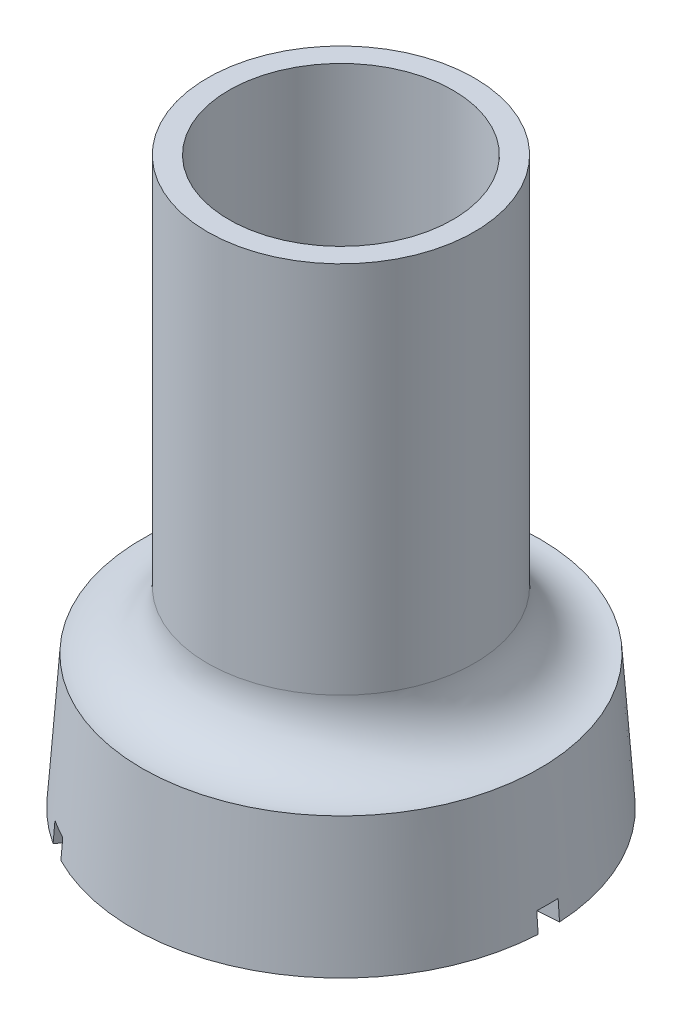
ISO-10303-21;
HEADER;
FILE_DESCRIPTION(('STEP AP214'),'2;1');
FILE_NAME('part.step','',(''),(''),'','','');
FILE_SCHEMA(('AUTOMOTIVE_DESIGN { 1 0 10303 214 1 1 1 1 }'));
ENDSEC;
DATA;
#1=APPLICATION_CONTEXT('core data for automotive mechanical design processes');
#2=APPLICATION_PROTOCOL_DEFINITION('international standard','automotive_design',2000,#1);
#3=PRODUCT_CONTEXT('',#1,'mechanical');
#4=PRODUCT('Part','Part','',(#3));
#5=PRODUCT_RELATED_PRODUCT_CATEGORY('part','',(#4));
#6=PRODUCT_DEFINITION_FORMATION('','',#4);
#7=PRODUCT_DEFINITION_CONTEXT('part definition',#1,'design');
#8=PRODUCT_DEFINITION('design','',#6,#7);
#9=PRODUCT_DEFINITION_SHAPE('','',#8);
#10=(LENGTH_UNIT() NAMED_UNIT(*) SI_UNIT(.MILLI.,.METRE.));
#11=(NAMED_UNIT(*) PLANE_ANGLE_UNIT() SI_UNIT($,.RADIAN.));
#12=(NAMED_UNIT(*) SI_UNIT($,.STERADIAN.) SOLID_ANGLE_UNIT());
#13=UNCERTAINTY_MEASURE_WITH_UNIT(LENGTH_MEASURE(1.E-05),#10,'distance_accuracy_value','');
#14=(GEOMETRIC_REPRESENTATION_CONTEXT(3) GLOBAL_UNCERTAINTY_ASSIGNED_CONTEXT((#13)) GLOBAL_UNIT_ASSIGNED_CONTEXT((#10,
#11,#12)) REPRESENTATION_CONTEXT('',''));
#15=CARTESIAN_POINT('',(0.,0.,0.));
#16=DIRECTION('',(0.,0.,1.));
#17=DIRECTION('',(1.,0.,0.));
#18=AXIS2_PLACEMENT_3D('',#15,#16,#17);
#19=CARTESIAN_POINT('',(0.,0.,0.));
#20=DIRECTION('',(0.,1.,0.));
#21=DIRECTION('',(0.,0.,1.));
#22=AXIS2_PLACEMENT_3D('',#19,#20,#21);
#23=CONICAL_SURFACE('',#22,1.95,1.50098315671512);
#24=CARTESIAN_POINT('',(0.,-0.0139512947488257,0.));
#25=DIRECTION('',(0.,-1.,0.));
#26=DIRECTION('',(0.,0.,-1.));
#27=AXIS2_PLACEMENT_3D('',#24,#25,#26);
#28=CIRCLE('',#27,1.75048718994804);
#29=CARTESIAN_POINT('',(-0.787211713649868,-0.0139512947488257,-1.56349068435492));
#30=VERTEX_POINT('',#29);
#31=CARTESIAN_POINT('',(1.74762850805661,-0.0139512947488257,-0.1));
#32=VERTEX_POINT('',#31);
#33=EDGE_CURVE('E320',#30,#32,#28,.T.);
#34=ORIENTED_EDGE('',*,*,#33,.F.);
#35=CARTESIAN_POINT('',(-0.785779303956134,-0.0141512947488257,-1.56100967798812));
#36=CARTESIAN_POINT('',(-0.802901588445392,-0.0117605817564088,-1.59066634466516));
#37=CARTESIAN_POINT('',(-0.820023866166642,-0.00936967490570539,-1.62032299961967));
#38=CARTESIAN_POINT('',(-0.854268408073065,-0.00458747348773431,-1.67963628608351));
#39=CARTESIAN_POINT('',(-0.871390672258238,-0.00219617892046662,-1.70929291759285));
#40=CARTESIAN_POINT('',(-0.888512929675402,0.0001953095050875,-1.73894953737965));
#41=B_SPLINE_CURVE_WITH_KNOTS('',3,(#35,#36,#37,#38,#39,#40),.UNSPECIFIED.,.F.,.F.,(4,2,4),(0.,
0.102983756569707,0.205967513139049),.UNSPECIFIED.);
#42=CARTESIAN_POINT('',(-0.887114564329087,0.,-1.73652749755229));
#43=VERTEX_POINT('',#42);
#44=EDGE_CURVE('E242',#30,#43,#41,.T.);
#45=ORIENTED_EDGE('',*,*,#44,.T.);
#46=CARTESIAN_POINT('',(0.,0.,0.));
#47=DIRECTION('',(0.,-1.,0.));
#48=DIRECTION('',(0.,0.,-1.));
#49=AXIS2_PLACEMENT_3D('',#46,#47,#48);
#50=CIRCLE('',#49,1.95);
#51=CARTESIAN_POINT('',(1.94743420941504,0.,-0.1));
#52=VERTEX_POINT('',#51);
#53=EDGE_CURVE('E317',#43,#52,#50,.T.);
#54=ORIENTED_EDGE('',*,*,#53,.T.);
#55=CARTESIAN_POINT('',(2.1918525792244,0.0170714122211321,-0.1));
#56=CARTESIAN_POINT('',(2.03560425011512,0.00615452522489807,-0.1));
#57=CARTESIAN_POINT('',(1.87935554766236,-0.0047570130130035,-0.1));
#58=CARTESIAN_POINT('',(1.56685739597063,-0.0265693919790709,-0.1));
#59=CARTESIAN_POINT('',(1.41060794673167,-0.03747023270723,-0.1));
#60=CARTESIAN_POINT('',(1.25435812414923,-0.0483657246770497,-0.1));
#61=B_SPLINE_CURVE_WITH_KNOTS('',3,(#55,#56,#57,#58,#59,#60),.UNSPECIFIED.,.F.,.F.,(4,2,4),(0.,
0.469887718677544,0.939775437653633),.UNSPECIFIED.);
#62=EDGE_CURVE('E257',#52,#32,#61,.T.);
#63=ORIENTED_EDGE('',*,*,#62,.T.);
#64=EDGE_LOOP('',(#34,#45,#54,#63));
#65=FACE_BOUND('',#64,.T.);
#66=ADVANCED_FACE('F33',(#65),#23,.T.);
#67=CARTESIAN_POINT('',(-1.06031964508595,0.,1.6365274975523));
#68=VERTEX_POINT('',#67);
#69=CARTESIAN_POINT('',(-1.06031964508597,0.,-1.63652749755229));
#70=VERTEX_POINT('',#69);
#71=EDGE_CURVE('E321',#68,#70,#50,.T.);
#72=ORIENTED_EDGE('',*,*,#71,.T.);
#73=CARTESIAN_POINT('',(-1.06171801043229,0.000195309505087506,-1.63894953737965));
#74=CARTESIAN_POINT('',(-1.04459575301513,-0.00219617892046662,-1.60929291759285));
#75=CARTESIAN_POINT('',(-1.02747348882995,-0.00458747348773432,-1.57963628608351));
#76=CARTESIAN_POINT('',(-0.993228946923529,-0.00936967490570539,-1.52032299961967));
#77=CARTESIAN_POINT('',(-0.976106669202279,-0.0117605817564088,-1.49066634466516));
#78=CARTESIAN_POINT('',(-0.958984384713021,-0.0141512947488257,-1.46100967798811));
#79=B_SPLINE_CURVE_WITH_KNOTS('',3,(#73,#74,#75,#76,#77,#78),.UNSPECIFIED.,.F.,.F.,(4,2,4),(0.,
0.102983756569342,0.205967513139049),.UNSPECIFIED.);
#80=CARTESIAN_POINT('',(-0.960416794406755,-0.0139512947488257,-1.46349068435492));
#81=VERTEX_POINT('',#80);
#82=EDGE_CURVE('E54',#70,#81,#79,.T.);
#83=ORIENTED_EDGE('',*,*,#82,.T.);
#84=CARTESIAN_POINT('',(-0.960416794406735,-0.0139512947488257,1.46349068435493));
#85=VERTEX_POINT('',#84);
#86=EDGE_CURVE('E322',#85,#81,#28,.T.);
#87=ORIENTED_EDGE('',*,*,#86,.F.);
#88=CARTESIAN_POINT('',(-0.958984384713001,-0.0141512947488257,1.46100967798813));
#89=CARTESIAN_POINT('',(-0.976106669202258,-0.0117605817564088,1.49066634466517));
#90=CARTESIAN_POINT('',(-0.993228946923508,-0.0093696749057054,1.52032299961968));
#91=CARTESIAN_POINT('',(-1.02747348882993,-0.00458747348773435,1.57963628608353));
#92=CARTESIAN_POINT('',(-1.0445957530151,-0.00219617892046666,1.60929291759286));
#93=CARTESIAN_POINT('',(-1.06171801043227,0.000195309505087454,1.63894953737966));
#94=B_SPLINE_CURVE_WITH_KNOTS('',3,(#88,#89,#90,#91,#92,#93),.UNSPECIFIED.,.F.,.F.,(4,2,4),(0.,
0.102983756569707,0.205967513139048),.UNSPECIFIED.);
#95=EDGE_CURVE('E139',#85,#68,#94,.T.);
#96=ORIENTED_EDGE('',*,*,#95,.T.);
#97=EDGE_LOOP('',(#72,#83,#87,#96));
#98=FACE_BOUND('',#97,.T.);
#99=ADVANCED_FACE('F339',(#98),#23,.T.);
#100=CARTESIAN_POINT('',(0.,1.06042940554287,0.));
#101=DIRECTION('',(0.,-1.,0.));
#102=DIRECTION('',(0.,0.,-1.));
#103=AXIS2_PLACEMENT_3D('',#100,#101,#102);
#104=CONICAL_SURFACE('',#103,1.675359172763,0.0698131700797734);
#105=CARTESIAN_POINT('',(-0.787218717769243,-0.0141512947488257,-1.56350281584554));
#106=CARTESIAN_POINT('',(-0.786049029835438,0.0192487074140294,-1.56147685691519));
#107=CARTESIAN_POINT('',(-0.784879334181795,0.052648708495457,-1.55945088461368));
#108=CARTESIAN_POINT('',(-0.782539927434834,0.119448708495457,-1.55539891326838));
#109=CARTESIAN_POINT('',(-0.781370216341515,0.15284870741403,-1.55337291422457));
#110=CARTESIAN_POINT('',(-0.780200497528359,0.186248705251175,-1.55134690180962));
#111=B_SPLINE_CURVE_WITH_KNOTS('',3,(#105,#106,#107,#108,#109,#110),.UNSPECIFIED.,.F.,.F.,(4,2,
4),(0.,0.100445484793254,0.200890969586507),.UNSPECIFIED.);
#112=CARTESIAN_POINT('',(-0.780207501833366,0.186048705251175,-1.55135903362176));
#113=VERTEX_POINT('',#112);
#114=EDGE_CURVE('E248',#30,#113,#111,.T.);
#115=ORIENTED_EDGE('',*,*,#114,.F.);
#116=ORIENTED_EDGE('',*,*,#33,.T.);
#117=CARTESIAN_POINT('',(1.71758227182459,0.415015954656677,-0.1));
#118=CARTESIAN_POINT('',(1.72697253729966,0.28095580730927,-0.1));
#119=CARTESIAN_POINT('',(1.73636255616042,0.146895642688635,-0.1));
#120=CARTESIAN_POINT('',(1.75514210065335,-0.121224721099077,-0.1));
#121=CARTESIAN_POINT('',(1.7645316262855,-0.255284920266155,-0.1));
#122=CARTESIAN_POINT('',(1.77392090530336,-0.38934513670646,-0.1));
#123=B_SPLINE_CURVE_WITH_KNOTS('',3,(#117,#118,#119,#120,#121,#122),.UNSPECIFIED.,.F.,.F.,(4,2,
4),(0.,0.403165848914384,0.806331697828724),.UNSPECIFIED.);
#124=CARTESIAN_POINT('',(1.7336200844236,0.186048705251175,-0.1));
#125=VERTEX_POINT('',#124);
#126=EDGE_CURVE('E265',#125,#32,#123,.T.);
#127=ORIENTED_EDGE('',*,*,#126,.F.);
#128=CARTESIAN_POINT('',(0.,0.186048705251175,0.));
#129=DIRECTION('',(0.,1.,0.));
#130=DIRECTION('',(0.,0.,1.));
#131=AXIS2_PLACEMENT_3D('',#128,#129,#130);
#132=CIRCLE('',#131,1.73650182755933);
#133=CARTESIAN_POINT('',(1.7336200844236,0.186048705251175,0.0999999999999999));
#134=VERTEX_POINT('',#133);
#135=EDGE_CURVE('E294',#134,#125,#132,.T.);
#136=ORIENTED_EDGE('',*,*,#135,.F.);
#137=CARTESIAN_POINT('',(1.77392090530336,-0.38934513670646,0.1));
#138=CARTESIAN_POINT('',(1.7645316262855,-0.255284920266154,0.1));
#139=CARTESIAN_POINT('',(1.75514210065335,-0.121224721099077,0.1));
#140=CARTESIAN_POINT('',(1.73636255616042,0.146895642688635,0.0999999999999999));
#141=CARTESIAN_POINT('',(1.72697253729966,0.28095580730927,0.0999999999999999));
#142=CARTESIAN_POINT('',(1.71758227182459,0.415015954656677,0.0999999999999999));
#143=B_SPLINE_CURVE_WITH_KNOTS('',3,(#137,#138,#139,#140,#141,#142),.UNSPECIFIED.,.F.,.F.,(4,2,
4),(0.,0.40316584891434,0.806331697828723),.UNSPECIFIED.);
#144=CARTESIAN_POINT('',(1.74762850805661,-0.0139512947488257,0.1));
#145=VERTEX_POINT('',#144);
#146=EDGE_CURVE('E293',#145,#134,#143,.T.);
#147=ORIENTED_EDGE('',*,*,#146,.F.);
#148=CARTESIAN_POINT('',(-0.787211713649846,-0.0139512947488257,1.56349068435493));
#149=VERTEX_POINT('',#148);
#150=EDGE_CURVE('E150',#145,#149,#28,.T.);
#151=ORIENTED_EDGE('',*,*,#150,.T.);
#152=CARTESIAN_POINT('',(-0.780200497528337,0.186248705251175,1.55134690180963));
#153=CARTESIAN_POINT('',(-0.781370216341493,0.15284870741403,1.55337291422458));
#154=CARTESIAN_POINT('',(-0.782539927434812,0.119448708495457,1.55539891326839));
#155=CARTESIAN_POINT('',(-0.784879334181773,0.0526487084954571,1.55945088461369));
#156=CARTESIAN_POINT('',(-0.786049029835416,0.0192487074140295,1.5614768569152));
#157=CARTESIAN_POINT('',(-0.787218717769221,-0.0141512947488257,1.56350281584555));
#158=B_SPLINE_CURVE_WITH_KNOTS('',3,(#152,#153,#154,#155,#156,#157),.UNSPECIFIED.,.F.,.F.,(4,2,
4),(0.,0.100445484793254,0.200890969586507),.UNSPECIFIED.);
#159=CARTESIAN_POINT('',(-0.780207501833344,0.186048705251175,1.55135903362177));
#160=VERTEX_POINT('',#159);
#161=EDGE_CURVE('E140',#160,#149,#158,.T.);
#162=ORIENTED_EDGE('',*,*,#161,.F.);
#163=CARTESIAN_POINT('',(0.,0.186048705251175,0.));
#164=DIRECTION('',(0.,1.,0.));
#165=DIRECTION('',(-1.,0.,0.));
#166=AXIS2_PLACEMENT_3D('',#163,#164,#165);
#167=CIRCLE('',#166,1.73650182755933);
#168=CARTESIAN_POINT('',(-0.953412582590232,0.186048705251175,1.45135903362177));
#169=VERTEX_POINT('',#168);
#170=EDGE_CURVE('E129',#169,#160,#167,.T.);
#171=ORIENTED_EDGE('',*,*,#170,.F.);
#172=CARTESIAN_POINT('',(-0.96042379852611,-0.0141512947488257,1.46350281584555));
#173=CARTESIAN_POINT('',(-0.959254110592304,0.0192487074140294,1.4614768569152));
#174=CARTESIAN_POINT('',(-0.958084414938662,0.052648708495457,1.4594508846137));
#175=CARTESIAN_POINT('',(-0.9557450081917,0.119448708495457,1.45539891326839));
#176=CARTESIAN_POINT('',(-0.954575297098382,0.15284870741403,1.45337291422459));
#177=CARTESIAN_POINT('',(-0.953405578285226,0.186248705251175,1.45134690180963));
#178=B_SPLINE_CURVE_WITH_KNOTS('',3,(#172,#173,#174,#175,#176,#177),.UNSPECIFIED.,.F.,.F.,(4,2,
4),(0.,0.100445484793253,0.200890969586507),.UNSPECIFIED.);
#179=EDGE_CURVE('E232',#85,#169,#178,.T.);
#180=ORIENTED_EDGE('',*,*,#179,.F.);
#181=ORIENTED_EDGE('',*,*,#86,.T.);
#182=CARTESIAN_POINT('',(-0.953405578285246,0.186248705251175,-1.45134690180962));
#183=CARTESIAN_POINT('',(-0.954575297098402,0.15284870741403,-1.45337291422457));
#184=CARTESIAN_POINT('',(-0.955745008191721,0.119448708495457,-1.45539891326838));
#185=CARTESIAN_POINT('',(-0.958084414938682,0.052648708495457,-1.45945088461368));
#186=CARTESIAN_POINT('',(-0.959254110592325,0.0192487074140295,-1.46147685691519));
#187=CARTESIAN_POINT('',(-0.96042379852613,-0.0141512947488257,-1.46350281584554));
#188=B_SPLINE_CURVE_WITH_KNOTS('',3,(#182,#183,#184,#185,#186,#187),.UNSPECIFIED.,.F.,.F.,(4,2,
4),(0.,0.100445484793254,0.200890969586507),.UNSPECIFIED.);
#189=CARTESIAN_POINT('',(-0.953412582590253,0.186048705251175,-1.45135903362176));
#190=VERTEX_POINT('',#189);
#191=EDGE_CURVE('E231',#190,#81,#188,.T.);
#192=ORIENTED_EDGE('',*,*,#191,.F.);
#193=CARTESIAN_POINT('',(0.,0.186048705251175,0.));
#194=DIRECTION('',(0.,1.,0.));
#195=DIRECTION('',(-1.,0.,0.));
#196=AXIS2_PLACEMENT_3D('',#193,#194,#195);
#197=CIRCLE('',#196,1.73650182755933);
#198=EDGE_CURVE('E240',#113,#190,#197,.T.);
#199=ORIENTED_EDGE('',*,*,#198,.F.);
#200=EDGE_LOOP('',(#115,#116,#127,#136,#147,#151,#162,#171,#180,#181,#192,#199));
#201=FACE_BOUND('',#200,.T.);
#202=CARTESIAN_POINT('',(0.,1.06042940554287,0.));
#203=DIRECTION('',(0.,-1.,0.));
#204=DIRECTION('',(0.,0.,-1.));
#205=AXIS2_PLACEMENT_3D('',#202,#203,#204);
#206=CIRCLE('',#205,1.675359172763);
#207=CARTESIAN_POINT('',(0.,1.06042940554287,-1.675359172763));
#208=VERTEX_POINT('',#207);
#209=EDGE_CURVE('E299',#208,#208,#206,.T.);
#210=ORIENTED_EDGE('',*,*,#209,.F.);
#211=EDGE_LOOP('',(#210));
#212=FACE_BOUND('',#211,.T.);
#213=ADVANCED_FACE('F35',(#201,#212),#104,.F.);
#214=CARTESIAN_POINT('',(1.94743420941504,0.,0.1));
#215=VERTEX_POINT('',#214);
#216=CARTESIAN_POINT('',(-0.887114564329062,0.,1.7365274975523));
#217=VERTEX_POINT('',#216);
#218=EDGE_CURVE('E318',#215,#217,#50,.T.);
#219=ORIENTED_EDGE('',*,*,#218,.T.);
#220=CARTESIAN_POINT('',(-0.888512929675378,0.000195309505087476,1.73894953737966));
#221=CARTESIAN_POINT('',(-0.871390672258214,-0.00219617892046664,1.70929291759286));
#222=CARTESIAN_POINT('',(-0.854268408073041,-0.00458747348773434,1.67963628608353));
#223=CARTESIAN_POINT('',(-0.820023866166619,-0.00936967490570541,1.62032299961968));
#224=CARTESIAN_POINT('',(-0.80290158844537,-0.0117605817564088,1.59066634466517));
#225=CARTESIAN_POINT('',(-0.785779303956112,-0.0141512947488257,1.56100967798813));
#226=B_SPLINE_CURVE_WITH_KNOTS('',3,(#220,#221,#222,#223,#224,#225),.UNSPECIFIED.,.F.,.F.,(4,2,
4),(0.,0.102983756569341,0.205967513139049),.UNSPECIFIED.);
#227=EDGE_CURVE('E62',#217,#149,#226,.T.);
#228=ORIENTED_EDGE('',*,*,#227,.T.);
#229=ORIENTED_EDGE('',*,*,#150,.F.);
#230=CARTESIAN_POINT('',(1.25435812414923,-0.0483657246770497,0.1));
#231=CARTESIAN_POINT('',(1.41060794673167,-0.03747023270723,0.1));
#232=CARTESIAN_POINT('',(1.56685739597063,-0.0265693919790709,0.1));
#233=CARTESIAN_POINT('',(1.87935554766236,-0.0047570130130035,0.1));
#234=CARTESIAN_POINT('',(2.03560425011512,0.00615452522489807,0.1));
#235=CARTESIAN_POINT('',(2.1918525792244,0.0170714122211321,0.1));
#236=B_SPLINE_CURVE_WITH_KNOTS('',3,(#230,#231,#232,#233,#234,#235),.UNSPECIFIED.,.F.,.F.,(4,2,
4),(0.,0.469887718976089,0.939775437653633),.UNSPECIFIED.);
#237=EDGE_CURVE('E288',#145,#215,#236,.T.);
#238=ORIENTED_EDGE('',*,*,#237,.T.);
#239=EDGE_LOOP('',(#219,#228,#229,#238));
#240=FACE_BOUND('',#239,.T.);
#241=ADVANCED_FACE('F191',(#240),#23,.T.);
#242=CARTESIAN_POINT('',(0.,1.25354481010212,0.));
#243=DIRECTION('',(0.,-1.,0.));
#244=DIRECTION('',(0.,0.,-1.));
#245=AXIS2_PLACEMENT_3D('',#242,#243,#244);
#246=CONICAL_SURFACE('',#245,1.86234360780123,0.0698131700797734);
#247=ORIENTED_EDGE('',*,*,#53,.F.);
#248=CARTESIAN_POINT('',(-0.887121566223237,-0.0002,-1.73653962518871));
#249=CARTESIAN_POINT('',(-0.886033654469791,0.0308747855584299,-1.73465530675759));
#250=CARTESIAN_POINT('',(-0.884945737896616,0.0619495704419093,-1.73277097997845));
#251=CARTESIAN_POINT('',(-0.882769895110814,0.124099138858968,-1.72900230972416));
#252=CARTESIAN_POINT('',(-0.881681968898185,0.155173922392546,-1.727117966249));
#253=CARTESIAN_POINT('',(-0.880594037865829,0.186248705251175,-1.72523361442583));
#254=B_SPLINE_CURVE_WITH_KNOTS('',3,(#248,#249,#250,#251,#252,#253),.UNSPECIFIED.,.F.,.F.,(4,2,
4),(0.,0.0934526005465736,0.186905201093147),.UNSPECIFIED.);
#255=CARTESIAN_POINT('',(-0.880601039884537,0.186048705251174,-1.72524574227799));
#256=VERTEX_POINT('',#255);
#257=EDGE_CURVE('E11',#43,#256,#254,.T.);
#258=ORIENTED_EDGE('',*,*,#257,.T.);
#259=CARTESIAN_POINT('',(0.,0.186048705251174,0.));
#260=DIRECTION('',(0.,1.,0.));
#261=DIRECTION('',(-1.,0.,0.));
#262=AXIS2_PLACEMENT_3D('',#259,#260,#261);
#263=CIRCLE('',#262,1.93699020717557);
#264=CARTESIAN_POINT('',(-1.05380612064142,0.186048705251175,-1.62524574227799));
#265=VERTEX_POINT('',#264);
#266=EDGE_CURVE('E47',#256,#265,#263,.T.);
#267=ORIENTED_EDGE('',*,*,#266,.T.);
#268=CARTESIAN_POINT('',(-1.05379911862272,0.186248705251175,-1.62523361442583));
#269=CARTESIAN_POINT('',(-1.05488704965507,0.155173922392546,-1.627117966249));
#270=CARTESIAN_POINT('',(-1.0559749758677,0.124099138858968,-1.62900230972416));
#271=CARTESIAN_POINT('',(-1.0581508186535,0.0619495704419093,-1.63277097997845));
#272=CARTESIAN_POINT('',(-1.05923873522668,0.0308747855584299,-1.63465530675759));
#273=CARTESIAN_POINT('',(-1.06032664698012,-0.000200000000000015,-1.63653962518871));
#274=B_SPLINE_CURVE_WITH_KNOTS('',3,(#268,#269,#270,#271,#272,#273),.UNSPECIFIED.,.F.,.F.,(4,2,
4),(0.,0.0934526005465737,0.186905201093147),.UNSPECIFIED.);
#275=EDGE_CURVE('E212',#265,#70,#274,.T.);
#276=ORIENTED_EDGE('',*,*,#275,.T.);
#277=ORIENTED_EDGE('',*,*,#71,.F.);
#278=CARTESIAN_POINT('',(-1.0603266469801,-0.000200000000000005,1.63653962518872));
#279=CARTESIAN_POINT('',(-1.05923873522666,0.0308747855584299,1.6346553067576));
#280=CARTESIAN_POINT('',(-1.05815081865348,0.0619495704419093,1.63277097997847));
#281=CARTESIAN_POINT('',(-1.05597497586768,0.124099138858968,1.62900230972417));
#282=CARTESIAN_POINT('',(-1.05488704965505,0.155173922392546,1.62711796624901));
#283=CARTESIAN_POINT('',(-1.05379911862269,0.186248705251175,1.62523361442584));
#284=B_SPLINE_CURVE_WITH_KNOTS('',3,(#278,#279,#280,#281,#282,#283),.UNSPECIFIED.,.F.,.F.,(4,2,
4),(0.,0.0934526005465736,0.186905201093147),.UNSPECIFIED.);
#285=CARTESIAN_POINT('',(-1.0538061206414,0.186048705251175,1.625245742278));
#286=VERTEX_POINT('',#285);
#287=EDGE_CURVE('E207',#68,#286,#284,.T.);
#288=ORIENTED_EDGE('',*,*,#287,.T.);
#289=CARTESIAN_POINT('',(0.,0.186048705251175,0.));
#290=DIRECTION('',(0.,1.,0.));
#291=DIRECTION('',(-1.,0.,0.));
#292=AXIS2_PLACEMENT_3D('',#289,#290,#291);
#293=CIRCLE('',#292,1.93699020717557);
#294=CARTESIAN_POINT('',(-0.880601039884512,0.186048705251175,1.725245742278));
#295=VERTEX_POINT('',#294);
#296=EDGE_CURVE('E178',#286,#295,#293,.T.);
#297=ORIENTED_EDGE('',*,*,#296,.T.);
#298=CARTESIAN_POINT('',(-0.880594037865805,0.186248705251175,1.72523361442584));
#299=CARTESIAN_POINT('',(-0.881681968898161,0.155173922392546,1.72711796624901));
#300=CARTESIAN_POINT('',(-0.882769895110789,0.124099138858968,1.72900230972417));
#301=CARTESIAN_POINT('',(-0.884945737896592,0.0619495704419094,1.73277097997846));
#302=CARTESIAN_POINT('',(-0.886033654469766,0.0308747855584299,1.7346553067576));
#303=CARTESIAN_POINT('',(-0.887121566223213,-0.000200000000000015,1.73653962518872));
#304=B_SPLINE_CURVE_WITH_KNOTS('',3,(#298,#299,#300,#301,#302,#303),.UNSPECIFIED.,.F.,.F.,(4,2,
4),(0.,0.0934526005465737,0.186905201093147),.UNSPECIFIED.);
#305=EDGE_CURVE('E143',#295,#217,#304,.T.);
#306=ORIENTED_EDGE('',*,*,#305,.T.);
#307=ORIENTED_EDGE('',*,*,#218,.F.);
#308=CARTESIAN_POINT('',(1.98678118254807,-0.561962186393314,0.1));
#309=CARTESIAN_POINT('',(1.97253696995967,-0.35851773955776,0.1));
#310=CARTESIAN_POINT('',(1.95829234599835,-0.155073321526253,0.1));
#311=CARTESIAN_POINT('',(1.92980227532988,0.251815456928703,0.0999999999999999));
#312=CARTESIAN_POINT('',(1.91555682862272,0.455259817352153,0.0999999999999999));
#313=CARTESIAN_POINT('',(1.90131097054265,0.658704148971555,0.0999999999999999));
#314=B_SPLINE_CURVE_WITH_KNOTS('',3,(#308,#309,#310,#311,#312,#313),.UNSPECIFIED.,.F.,.F.,(4,2,
4),(0.,0.611827479654029,1.22365495930817),.UNSPECIFIED.);
#315=CARTESIAN_POINT('',(1.93440716052594,0.186048705251175,0.0999999999999999));
#316=VERTEX_POINT('',#315);
#317=EDGE_CURVE('E179',#215,#316,#314,.T.);
#318=ORIENTED_EDGE('',*,*,#317,.T.);
#319=CARTESIAN_POINT('',(0.,0.186048705251175,0.));
#320=DIRECTION('',(0.,1.,0.));
#321=DIRECTION('',(0.,0.,1.));
#322=AXIS2_PLACEMENT_3D('',#319,#320,#321);
#323=CIRCLE('',#322,1.93699020717557);
#324=CARTESIAN_POINT('',(1.93440716052594,0.186048705251175,-0.1));
#325=VERTEX_POINT('',#324);
#326=EDGE_CURVE('E324',#316,#325,#323,.T.);
#327=ORIENTED_EDGE('',*,*,#326,.T.);
#328=CARTESIAN_POINT('',(1.90131097054265,0.658704148971555,-0.1));
#329=CARTESIAN_POINT('',(1.91555682862272,0.455259817352153,-0.1));
#330=CARTESIAN_POINT('',(1.92980227532988,0.251815456928703,-0.1));
#331=CARTESIAN_POINT('',(1.95829234599835,-0.155073321526253,-0.1));
#332=CARTESIAN_POINT('',(1.97253696995967,-0.35851773955776,-0.1));
#333=CARTESIAN_POINT('',(1.98678118254807,-0.561962186393314,-0.1));
#334=B_SPLINE_CURVE_WITH_KNOTS('',3,(#328,#329,#330,#331,#332,#333),.UNSPECIFIED.,.F.,.F.,(4,2,
4),(0.,0.611827479654139,1.22365495930817),.UNSPECIFIED.);
#335=EDGE_CURVE('E198',#325,#52,#334,.T.);
#336=ORIENTED_EDGE('',*,*,#335,.T.);
#337=EDGE_LOOP('',(#247,#258,#267,#276,#277,#288,#297,#306,#307,#318,#327,#336));
#338=FACE_BOUND('',#337,.T.);
#339=CARTESIAN_POINT('',(0.,1.25354481010212,0.));
#340=DIRECTION('',(0.,-1.,0.));
#341=DIRECTION('',(0.,0.,-1.));
#342=AXIS2_PLACEMENT_3D('',#339,#340,#341);
#343=CIRCLE('',#342,1.86234360780123);
#344=CARTESIAN_POINT('',(0.,1.25354481010212,-1.86234360780123));
#345=VERTEX_POINT('',#344);
#346=EDGE_CURVE('E314',#345,#345,#343,.T.);
#347=ORIENTED_EDGE('',*,*,#346,.T.);
#348=EDGE_LOOP('',(#347));
#349=FACE_BOUND('',#348,.T.);
#350=ADVANCED_FACE('F186',(#338,#349),#246,.T.);
#351=CARTESIAN_POINT('',(0.,1.8,0.));
#352=DIRECTION('',(0.,-1.,0.));
#353=DIRECTION('',(0.,0.,-1.));
#354=AXIS2_PLACEMENT_3D('',#351,#352,#353);
#355=TOROIDAL_SURFACE('',#354,1.8,0.55);
#356=ORIENTED_EDGE('',*,*,#346,.F.);
#357=EDGE_LOOP('',(#356));
#358=FACE_BOUND('',#357,.T.);
#359=CARTESIAN_POINT('',(0.,1.8,0.));
#360=DIRECTION('',(0.,-1.,0.));
#361=DIRECTION('',(0.,0.,-1.));
#362=AXIS2_PLACEMENT_3D('',#359,#360,#361);
#363=CIRCLE('',#362,1.25);
#364=CARTESIAN_POINT('',(0.,1.8,-1.25));
#365=VERTEX_POINT('',#364);
#366=EDGE_CURVE('E311',#365,#365,#363,.T.);
#367=ORIENTED_EDGE('',*,*,#366,.T.);
#368=EDGE_LOOP('',(#367));
#369=FACE_BOUND('',#368,.T.);
#370=ADVANCED_FACE('F190',(#358,#369),#355,.F.);
#371=CARTESIAN_POINT('',(0.,0.,0.));
#372=DIRECTION('',(0.,-1.,0.));
#373=DIRECTION('',(0.,0.,-1.));
#374=AXIS2_PLACEMENT_3D('',#371,#372,#373);
#375=CYLINDRICAL_SURFACE('',#374,1.25);
#376=ORIENTED_EDGE('',*,*,#366,.F.);
#377=EDGE_LOOP('',(#376));
#378=FACE_BOUND('',#377,.T.);
#379=CARTESIAN_POINT('',(0.,5.3,0.));
#380=DIRECTION('',(0.,-1.,0.));
#381=DIRECTION('',(0.,0.,-1.));
#382=AXIS2_PLACEMENT_3D('',#379,#380,#381);
#383=CIRCLE('',#382,1.25);
#384=CARTESIAN_POINT('',(0.,5.3,-1.25));
#385=VERTEX_POINT('',#384);
#386=EDGE_CURVE('E308',#385,#385,#383,.T.);
#387=ORIENTED_EDGE('',*,*,#386,.T.);
#388=EDGE_LOOP('',(#387));
#389=FACE_BOUND('',#388,.T.);
#390=ADVANCED_FACE('F430',(#378,#389),#375,.T.);
#391=CARTESIAN_POINT('',(0.,5.3,-1.05));
#392=DIRECTION('',(0.,-1.,0.));
#393=DIRECTION('',(0.,0.,-1.));
#394=AXIS2_PLACEMENT_3D('',#391,#392,#393);
#395=PLANE('',#394);
#396=ORIENTED_EDGE('',*,*,#386,.F.);
#397=EDGE_LOOP('',(#396));
#398=FACE_BOUND('',#397,.T.);
#399=CARTESIAN_POINT('',(0.,5.3,0.));
#400=DIRECTION('',(0.,-1.,0.));
#401=DIRECTION('',(0.,0.,-1.));
#402=AXIS2_PLACEMENT_3D('',#399,#400,#401);
#403=CIRCLE('',#402,1.05);
#404=CARTESIAN_POINT('',(0.,5.3,-1.05));
#405=VERTEX_POINT('',#404);
#406=EDGE_CURVE('E305',#405,#405,#403,.T.);
#407=ORIENTED_EDGE('',*,*,#406,.T.);
#408=EDGE_LOOP('',(#407));
#409=FACE_BOUND('',#408,.T.);
#410=ADVANCED_FACE('F421',(#398,#409),#395,.F.);
#411=CARTESIAN_POINT('',(0.,0.,0.));
#412=DIRECTION('',(0.,-1.,0.));
#413=DIRECTION('',(0.,0.,-1.));
#414=AXIS2_PLACEMENT_3D('',#411,#412,#413);
#415=CYLINDRICAL_SURFACE('',#414,1.05);
#416=CARTESIAN_POINT('',(0.,1.8,0.));
#417=DIRECTION('',(0.,-1.,0.));
#418=DIRECTION('',(0.,0.,-1.));
#419=AXIS2_PLACEMENT_3D('',#416,#417,#418);
#420=CIRCLE('',#419,1.05);
#421=CARTESIAN_POINT('',(0.,1.8,-1.05));
#422=VERTEX_POINT('',#421);
#423=EDGE_CURVE('E302',#422,#422,#420,.T.);
#424=ORIENTED_EDGE('',*,*,#423,.T.);
#425=EDGE_LOOP('',(#424));
#426=FACE_BOUND('',#425,.T.);
#427=ORIENTED_EDGE('',*,*,#406,.F.);
#428=EDGE_LOOP('',(#427));
#429=FACE_BOUND('',#428,.T.);
#430=ADVANCED_FACE('F368',(#426,#429),#415,.F.);
#431=CARTESIAN_POINT('',(0.,1.8,0.));
#432=DIRECTION('',(0.,-1.,0.));
#433=DIRECTION('',(0.,0.,-1.));
#434=AXIS2_PLACEMENT_3D('',#431,#432,#433);
#435=TOROIDAL_SURFACE('',#434,1.8,0.75);
#436=ORIENTED_EDGE('',*,*,#209,.T.);
#437=EDGE_LOOP('',(#436));
#438=FACE_BOUND('',#437,.T.);
#439=ORIENTED_EDGE('',*,*,#423,.F.);
#440=EDGE_LOOP('',(#439));
#441=FACE_BOUND('',#440,.T.);
#442=ADVANCED_FACE('F282',(#438,#441),#435,.T.);
#443=CARTESIAN_POINT('',(1.69,0.186048705251175,-0.1));
#444=DIRECTION('',(0.,1.,0.));
#445=DIRECTION('',(0.,0.,1.));
#446=AXIS2_PLACEMENT_3D('',#443,#444,#445);
#447=PLANE('',#446);
#448=ORIENTED_EDGE('',*,*,#135,.T.);
#449=DIRECTION('',(1.,0.,0.));
#450=VECTOR('',#449,1.);
#451=CARTESIAN_POINT('',(1.69,0.186048705251175,-0.1));
#452=LINE('',#451,#450);
#453=EDGE_CURVE('E253',#125,#325,#452,.T.);
#454=ORIENTED_EDGE('',*,*,#453,.T.);
#455=ORIENTED_EDGE('',*,*,#326,.F.);
#456=DIRECTION('',(1.,0.,0.));
#457=VECTOR('',#456,1.);
#458=CARTESIAN_POINT('',(1.69,0.186048705251175,0.0999999999999999));
#459=LINE('',#458,#457);
#460=EDGE_CURVE('E254',#134,#316,#459,.T.);
#461=ORIENTED_EDGE('',*,*,#460,.F.);
#462=EDGE_LOOP('',(#448,#454,#455,#461));
#463=FACE_BOUND('',#462,.T.);
#464=ADVANCED_FACE('F275',(#463),#447,.F.);
#465=CARTESIAN_POINT('',(1.69,-0.213951294748825,0.1));
#466=DIRECTION('',(0.,0.,1.));
#467=DIRECTION('',(0.,-1.,0.));
#468=AXIS2_PLACEMENT_3D('',#465,#466,#467);
#469=PLANE('',#468);
#470=ORIENTED_EDGE('',*,*,#146,.T.);
#471=ORIENTED_EDGE('',*,*,#460,.T.);
#472=ORIENTED_EDGE('',*,*,#317,.F.);
#473=ORIENTED_EDGE('',*,*,#237,.F.);
#474=EDGE_LOOP('',(#470,#471,#472,#473));
#475=FACE_BOUND('',#474,.T.);
#476=ADVANCED_FACE('F273',(#475),#469,.F.);
#477=CARTESIAN_POINT('',(1.69,-0.213951294748825,-0.1));
#478=DIRECTION('',(0.,0.,-1.));
#479=DIRECTION('',(-1.,0.,0.));
#480=AXIS2_PLACEMENT_3D('',#477,#478,#479);
#481=PLANE('',#480);
#482=ORIENTED_EDGE('',*,*,#126,.T.);
#483=ORIENTED_EDGE('',*,*,#62,.F.);
#484=ORIENTED_EDGE('',*,*,#335,.F.);
#485=ORIENTED_EDGE('',*,*,#453,.F.);
#486=EDGE_LOOP('',(#482,#483,#484,#485));
#487=FACE_BOUND('',#486,.T.);
#488=ADVANCED_FACE('F270',(#487),#481,.F.);
#489=CARTESIAN_POINT('',(-0.758397459621542,0.186048705251175,1.51358293239571));
#490=DIRECTION('',(0.,1.,0.));
#491=DIRECTION('',(-1.,0.,0.));
#492=AXIS2_PLACEMENT_3D('',#489,#490,#491);
#493=PLANE('',#492);
#494=ORIENTED_EDGE('',*,*,#170,.T.);
#495=DIRECTION('',(-0.499999999999992,0.,0.866025403784443));
#496=VECTOR('',#495,1.);
#497=CARTESIAN_POINT('',(-0.758397459621542,0.186048705251175,1.51358293239571));
#498=LINE('',#497,#496);
#499=EDGE_CURVE('E132',#160,#295,#498,.T.);
#500=ORIENTED_EDGE('',*,*,#499,.T.);
#501=ORIENTED_EDGE('',*,*,#296,.F.);
#502=DIRECTION('',(-0.499999999999992,0.,0.866025403784443));
#503=VECTOR('',#502,1.);
#504=CARTESIAN_POINT('',(-0.93160254037843,0.186048705251175,1.41358293239571));
#505=LINE('',#504,#503);
#506=EDGE_CURVE('E135',#169,#286,#505,.T.);
#507=ORIENTED_EDGE('',*,*,#506,.F.);
#508=EDGE_LOOP('',(#494,#500,#501,#507));
#509=FACE_BOUND('',#508,.T.);
#510=ADVANCED_FACE('F131',(#509),#493,.F.);
#511=CARTESIAN_POINT('',(-0.93160254037843,-0.213951294748825,1.41358293239571));
#512=DIRECTION('',(-0.866025403784443,0.,-0.499999999999992));
#513=DIRECTION('',(-0.499999999999992,0.,0.866025403784443));
#514=AXIS2_PLACEMENT_3D('',#511,#512,#513);
#515=PLANE('',#514);
#516=ORIENTED_EDGE('',*,*,#179,.T.);
#517=ORIENTED_EDGE('',*,*,#506,.T.);
#518=ORIENTED_EDGE('',*,*,#287,.F.);
#519=ORIENTED_EDGE('',*,*,#95,.F.);
#520=EDGE_LOOP('',(#516,#517,#518,#519));
#521=FACE_BOUND('',#520,.T.);
#522=ADVANCED_FACE('F167',(#521),#515,.F.);
#523=CARTESIAN_POINT('',(-0.758397459621542,-0.213951294748825,1.51358293239571));
#524=DIRECTION('',(0.866025403784443,0.,0.499999999999992));
#525=DIRECTION('',(0.499999999999992,0.,-0.866025403784443));
#526=AXIS2_PLACEMENT_3D('',#523,#524,#525);
#527=PLANE('',#526);
#528=ORIENTED_EDGE('',*,*,#161,.T.);
#529=ORIENTED_EDGE('',*,*,#227,.F.);
#530=ORIENTED_EDGE('',*,*,#305,.F.);
#531=ORIENTED_EDGE('',*,*,#499,.F.);
#532=EDGE_LOOP('',(#528,#529,#530,#531));
#533=FACE_BOUND('',#532,.T.);
#534=ADVANCED_FACE('F142',(#533),#527,.F.);
#535=CARTESIAN_POINT('',(-0.931602540378451,0.186048705251175,-1.4135829323957));
#536=DIRECTION('',(0.,1.,0.));
#537=DIRECTION('',(-1.,0.,0.));
#538=AXIS2_PLACEMENT_3D('',#535,#536,#537);
#539=PLANE('',#538);
#540=ORIENTED_EDGE('',*,*,#198,.T.);
#541=DIRECTION('',(-0.500000000000004,0.,-0.866025403784436));
#542=VECTOR('',#541,1.);
#543=CARTESIAN_POINT('',(-0.931602540378451,0.186048705251175,-1.4135829323957));
#544=LINE('',#543,#542);
#545=EDGE_CURVE('E346',#190,#265,#544,.T.);
#546=ORIENTED_EDGE('',*,*,#545,.T.);
#547=ORIENTED_EDGE('',*,*,#266,.F.);
#548=DIRECTION('',(-0.500000000000004,0.,-0.866025403784436));
#549=VECTOR('',#548,1.);
#550=CARTESIAN_POINT('',(-0.758397459621563,0.186048705251175,-1.5135829323957));
#551=LINE('',#550,#549);
#552=EDGE_CURVE('E152',#113,#256,#551,.T.);
#553=ORIENTED_EDGE('',*,*,#552,.F.);
#554=EDGE_LOOP('',(#540,#546,#547,#553));
#555=FACE_BOUND('',#554,.T.);
#556=ADVANCED_FACE('F166',(#555),#539,.F.);
#557=CARTESIAN_POINT('',(-0.758397459621563,-0.213951294748825,-1.5135829323957));
#558=DIRECTION('',(0.866025403784436,0.,-0.500000000000004));
#559=DIRECTION('',(-0.500000000000004,0.,-0.866025403784436));
#560=AXIS2_PLACEMENT_3D('',#557,#558,#559);
#561=PLANE('',#560);
#562=ORIENTED_EDGE('',*,*,#114,.T.);
#563=ORIENTED_EDGE('',*,*,#552,.T.);
#564=ORIENTED_EDGE('',*,*,#257,.F.);
#565=ORIENTED_EDGE('',*,*,#44,.F.);
#566=EDGE_LOOP('',(#562,#563,#564,#565));
#567=FACE_BOUND('',#566,.T.);
#568=ADVANCED_FACE('F221',(#567),#561,.F.);
#569=CARTESIAN_POINT('',(-0.931602540378451,-0.213951294748825,-1.4135829323957));
#570=DIRECTION('',(-0.866025403784436,0.,0.500000000000004));
#571=DIRECTION('',(0.500000000000004,0.,0.866025403784436));
#572=AXIS2_PLACEMENT_3D('',#569,#570,#571);
#573=PLANE('',#572);
#574=ORIENTED_EDGE('',*,*,#191,.T.);
#575=ORIENTED_EDGE('',*,*,#82,.F.);
#576=ORIENTED_EDGE('',*,*,#275,.F.);
#577=ORIENTED_EDGE('',*,*,#545,.F.);
#578=EDGE_LOOP('',(#574,#575,#576,#577));
#579=FACE_BOUND('',#578,.T.);
#580=ADVANCED_FACE('F217',(#579),#573,.F.);
#581=CLOSED_SHELL('',(#66,#99,#213,#241,#350,#370,#390,#410,#430,#442,#464,#476,#488,#510,#522,
#534,#556,#568,#580));
#582=MANIFOLD_SOLID_BREP('B2',#581);
#583=ADVANCED_BREP_SHAPE_REPRESENTATION('',(#18,#582),#14);
#584=SHAPE_DEFINITION_REPRESENTATION(#9,#583);
ENDSEC;
END-ISO-10303-21;
